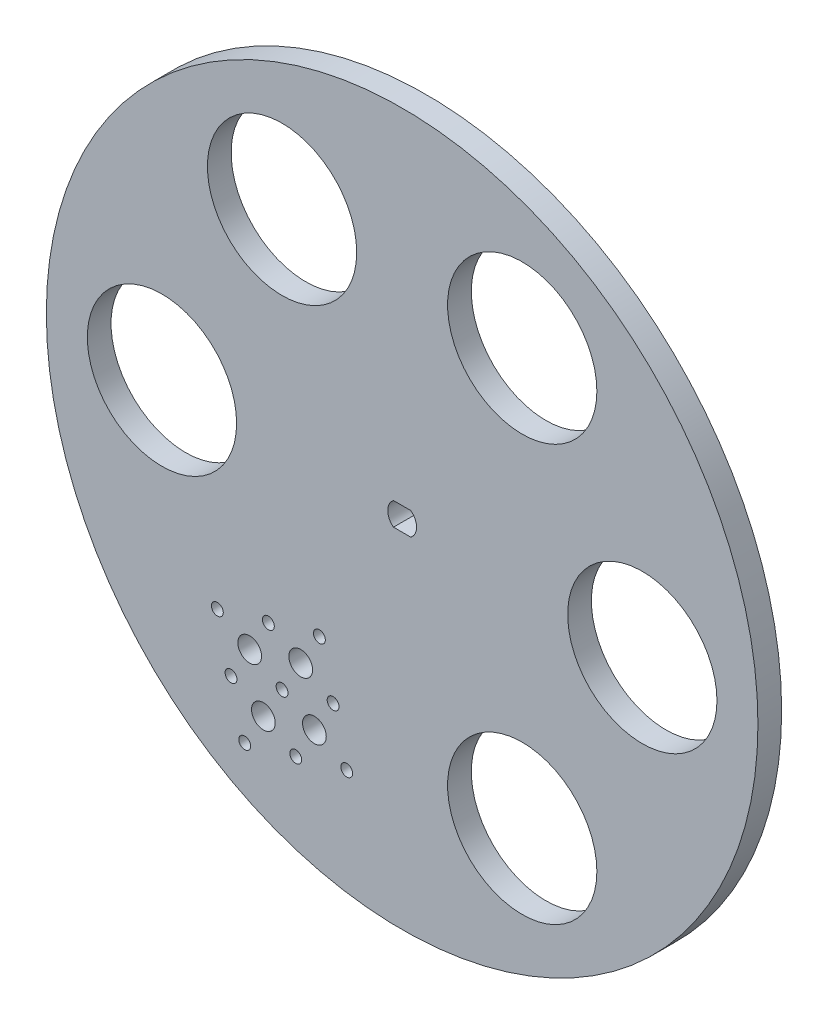
ISO-10303-21;
HEADER;
FILE_DESCRIPTION(('STEP AP214'),'2;1');
FILE_NAME('part.step','',(''),(''),'','','');
FILE_SCHEMA(('AUTOMOTIVE_DESIGN { 1 0 10303 214 1 1 1 1 }'));
ENDSEC;
DATA;
#1=APPLICATION_CONTEXT('core data for automotive mechanical design processes');
#2=APPLICATION_PROTOCOL_DEFINITION('international standard','automotive_design',2000,#1);
#3=PRODUCT_CONTEXT('',#1,'mechanical');
#4=PRODUCT('Part','Part','',(#3));
#5=PRODUCT_RELATED_PRODUCT_CATEGORY('part','',(#4));
#6=PRODUCT_DEFINITION_FORMATION('','',#4);
#7=PRODUCT_DEFINITION_CONTEXT('part definition',#1,'design');
#8=PRODUCT_DEFINITION('design','',#6,#7);
#9=PRODUCT_DEFINITION_SHAPE('','',#8);
#10=(LENGTH_UNIT() NAMED_UNIT(*) SI_UNIT(.MILLI.,.METRE.));
#11=(NAMED_UNIT(*) PLANE_ANGLE_UNIT() SI_UNIT($,.RADIAN.));
#12=(NAMED_UNIT(*) SI_UNIT($,.STERADIAN.) SOLID_ANGLE_UNIT());
#13=UNCERTAINTY_MEASURE_WITH_UNIT(LENGTH_MEASURE(1.E-05),#10,'distance_accuracy_value','');
#14=(GEOMETRIC_REPRESENTATION_CONTEXT(3) GLOBAL_UNCERTAINTY_ASSIGNED_CONTEXT((#13)) GLOBAL_UNIT_ASSIGNED_CONTEXT((#10,
#11,#12)) REPRESENTATION_CONTEXT('',''));
#15=CARTESIAN_POINT('',(0.,0.,0.));
#16=DIRECTION('',(0.,0.,1.));
#17=DIRECTION('',(1.,0.,0.));
#18=AXIS2_PLACEMENT_3D('',#15,#16,#17);
#19=CARTESIAN_POINT('',(0.,0.,4.));
#20=DIRECTION('',(0.,0.,-1.));
#21=DIRECTION('',(-1.,0.,0.));
#22=AXIS2_PLACEMENT_3D('',#19,#20,#21);
#23=CYLINDRICAL_SURFACE('',#22,60.);
#24=CARTESIAN_POINT('',(0.,0.,4.));
#25=DIRECTION('',(0.,0.,1.));
#26=DIRECTION('',(1.,0.,0.));
#27=AXIS2_PLACEMENT_3D('',#24,#25,#26);
#28=CIRCLE('',#27,60.);
#29=CARTESIAN_POINT('',(60.,0.,4.));
#30=VERTEX_POINT('',#29);
#31=EDGE_CURVE('E11',#30,#30,#28,.T.);
#32=ORIENTED_EDGE('',*,*,#31,.F.);
#33=EDGE_LOOP('',(#32));
#34=FACE_BOUND('',#33,.T.);
#35=CARTESIAN_POINT('',(0.,0.,0.));
#36=DIRECTION('',(0.,0.,1.));
#37=DIRECTION('',(1.,0.,0.));
#38=AXIS2_PLACEMENT_3D('',#35,#36,#37);
#39=CIRCLE('',#38,60.);
#40=CARTESIAN_POINT('',(60.,0.,0.));
#41=VERTEX_POINT('',#40);
#42=EDGE_CURVE('E48',#41,#41,#39,.T.);
#43=ORIENTED_EDGE('',*,*,#42,.T.);
#44=EDGE_LOOP('',(#43));
#45=FACE_BOUND('',#44,.T.);
#46=ADVANCED_FACE('F45',(#34,#45),#23,.T.);
#47=CARTESIAN_POINT('',(0.,0.,4.));
#48=DIRECTION('',(0.,0.,1.));
#49=DIRECTION('',(1.,0.,0.));
#50=AXIS2_PLACEMENT_3D('',#47,#48,#49);
#51=PLANE('',#50);
#52=CARTESIAN_POINT('',(-31.161920087684,-28.77402885327,4.));
#53=DIRECTION('',(0.,0.,1.));
#54=DIRECTION('',(1.,0.,0.));
#55=AXIS2_PLACEMENT_3D('',#52,#53,#54);
#56=CIRCLE('',#55,1.00000000000015);
#57=CARTESIAN_POINT('',(-30.1619200876839,-28.77402885327,4.));
#58=VERTEX_POINT('',#57);
#59=EDGE_CURVE('E188',#58,#58,#56,.T.);
#60=ORIENTED_EDGE('',*,*,#59,.F.);
#61=EDGE_LOOP('',(#60));
#62=FACE_BOUND('',#61,.T.);
#63=CARTESIAN_POINT('',(-23.4,-40.5299888971117,4.));
#64=DIRECTION('',(0.,0.,1.));
#65=DIRECTION('',(1.,0.,0.));
#66=AXIS2_PLACEMENT_3D('',#63,#64,#65);
#67=CIRCLE('',#66,2.);
#68=CARTESIAN_POINT('',(-21.4,-40.5299888971117,4.));
#69=VERTEX_POINT('',#68);
#70=EDGE_CURVE('E196',#69,#69,#67,.T.);
#71=ORIENTED_EDGE('',*,*,#70,.F.);
#72=EDGE_LOOP('',(#71));
#73=FACE_BOUND('',#72,.T.);
#74=CARTESIAN_POINT('',(-20.25,-35.0740288532697,4.));
#75=DIRECTION('',(0.,0.,1.));
#76=DIRECTION('',(1.,0.,0.));
#77=AXIS2_PLACEMENT_3D('',#74,#75,#76);
#78=CIRCLE('',#77,1.00000000000001);
#79=CARTESIAN_POINT('',(-19.25,-35.0740288532697,4.));
#80=VERTEX_POINT('',#79);
#81=EDGE_CURVE('E204',#80,#80,#78,.T.);
#82=ORIENTED_EDGE('',*,*,#81,.F.);
#83=EDGE_LOOP('',(#82));
#84=FACE_BOUND('',#83,.T.);
#85=CARTESIAN_POINT('',(-14.794039956158,-38.2240288532697,4.));
#86=DIRECTION('',(0.,0.,1.));
#87=DIRECTION('',(1.,0.,0.));
#88=AXIS2_PLACEMENT_3D('',#85,#86,#87);
#89=CIRCLE('',#88,2.);
#90=CARTESIAN_POINT('',(-12.794039956158,-38.2240288532697,4.));
#91=VERTEX_POINT('',#90);
#92=EDGE_CURVE('E155',#91,#91,#89,.T.);
#93=ORIENTED_EDGE('',*,*,#92,.F.);
#94=EDGE_LOOP('',(#93));
#95=FACE_BOUND('',#94,.T.);
#96=CARTESIAN_POINT('',(-11.644039956158,-32.7680688094278,4.));
#97=DIRECTION('',(0.,0.,1.));
#98=DIRECTION('',(1.,0.,0.));
#99=AXIS2_PLACEMENT_3D('',#96,#97,#98);
#100=CIRCLE('',#99,1.);
#101=CARTESIAN_POINT('',(-10.644039956158,-32.7680688094278,4.));
#102=VERTEX_POINT('',#101);
#103=EDGE_CURVE('E156',#102,#102,#100,.T.);
#104=ORIENTED_EDGE('',*,*,#103,.F.);
#105=EDGE_LOOP('',(#104));
#106=FACE_BOUND('',#105,.T.);
#107=CARTESIAN_POINT('',(-9.33807991231601,-41.3740288532696,4.));
#108=DIRECTION('',(0.,0.,1.));
#109=DIRECTION('',(1.,0.,0.));
#110=AXIS2_PLACEMENT_3D('',#107,#108,#109);
#111=CIRCLE('',#110,0.999999999999997);
#112=CARTESIAN_POINT('',(-8.33807991231601,-41.3740288532696,4.));
#113=VERTEX_POINT('',#112);
#114=EDGE_CURVE('E164',#113,#113,#111,.T.);
#115=ORIENTED_EDGE('',*,*,#114,.F.);
#116=EDGE_LOOP('',(#115));
#117=FACE_BOUND('',#116,.T.);
#118=CARTESIAN_POINT('',(-17.9440399561581,-43.6799888971117,4.));
#119=DIRECTION('',(0.,0.,1.));
#120=DIRECTION('',(1.,0.,0.));
#121=AXIS2_PLACEMENT_3D('',#118,#119,#120);
#122=CIRCLE('',#121,1.00000000000011);
#123=CARTESIAN_POINT('',(-16.944039956158,-43.6799888971117,4.));
#124=VERTEX_POINT('',#123);
#125=EDGE_CURVE('E172',#124,#124,#122,.T.);
#126=ORIENTED_EDGE('',*,*,#125,.F.);
#127=EDGE_LOOP('',(#126));
#128=FACE_BOUND('',#127,.T.);
#129=CARTESIAN_POINT('',(-26.5499999999997,-45.9859489409545,4.));
#130=DIRECTION('',(0.,0.,1.));
#131=DIRECTION('',(1.,0.,0.));
#132=AXIS2_PLACEMENT_3D('',#129,#130,#131);
#133=CIRCLE('',#132,1.00000000000007);
#134=CARTESIAN_POINT('',(-25.5499999999997,-45.9859489409545,4.));
#135=VERTEX_POINT('',#134);
#136=EDGE_CURVE('E128',#135,#135,#133,.T.);
#137=ORIENTED_EDGE('',*,*,#136,.F.);
#138=EDGE_LOOP('',(#137));
#139=FACE_BOUND('',#138,.T.);
#140=CARTESIAN_POINT('',(20.2499999999999,35.0740288532698,4.));
#141=DIRECTION('',(0.,0.,1.));
#142=DIRECTION('',(1.,0.,0.));
#143=AXIS2_PLACEMENT_3D('',#140,#141,#142);
#144=CIRCLE('',#143,12.5875);
#145=CARTESIAN_POINT('',(32.8374999999999,35.0740288532698,4.));
#146=VERTEX_POINT('',#145);
#147=EDGE_CURVE('E252',#146,#146,#144,.T.);
#148=ORIENTED_EDGE('',*,*,#147,.F.);
#149=EDGE_LOOP('',(#148));
#150=FACE_BOUND('',#149,.T.);
#151=CARTESIAN_POINT('',(-20.25,35.0740288532698,4.));
#152=DIRECTION('',(0.,0.,1.));
#153=DIRECTION('',(1.,0.,0.));
#154=AXIS2_PLACEMENT_3D('',#151,#152,#153);
#155=CIRCLE('',#154,12.5875);
#156=CARTESIAN_POINT('',(-7.6625,35.0740288532698,4.));
#157=VERTEX_POINT('',#156);
#158=EDGE_CURVE('E260',#157,#157,#155,.T.);
#159=ORIENTED_EDGE('',*,*,#158,.F.);
#160=EDGE_LOOP('',(#159));
#161=FACE_BOUND('',#160,.T.);
#162=CARTESIAN_POINT('',(-40.5,0.,4.));
#163=DIRECTION('',(0.,0.,1.));
#164=DIRECTION('',(1.,0.,0.));
#165=AXIS2_PLACEMENT_3D('',#162,#163,#164);
#166=CIRCLE('',#165,12.5875);
#167=CARTESIAN_POINT('',(-27.9125,0.,4.));
#168=VERTEX_POINT('',#167);
#169=EDGE_CURVE('E268',#168,#168,#166,.T.);
#170=ORIENTED_EDGE('',*,*,#169,.F.);
#171=EDGE_LOOP('',(#170));
#172=FACE_BOUND('',#171,.T.);
#173=CARTESIAN_POINT('',(20.25,-35.0740288532697,4.));
#174=DIRECTION('',(0.,0.,1.));
#175=DIRECTION('',(1.,0.,0.));
#176=AXIS2_PLACEMENT_3D('',#173,#174,#175);
#177=CIRCLE('',#176,12.5875);
#178=CARTESIAN_POINT('',(32.8375,-35.0740288532697,4.));
#179=VERTEX_POINT('',#178);
#180=EDGE_CURVE('E219',#179,#179,#177,.T.);
#181=ORIENTED_EDGE('',*,*,#180,.F.);
#182=EDGE_LOOP('',(#181));
#183=FACE_BOUND('',#182,.T.);
#184=CARTESIAN_POINT('',(-13.9500000000001,-24.1621087655858,4.));
#185=DIRECTION('',(0.,0.,1.));
#186=DIRECTION('',(1.,0.,0.));
#187=AXIS2_PLACEMENT_3D('',#184,#185,#186);
#188=CIRCLE('',#187,1.);
#189=CARTESIAN_POINT('',(-12.9500000000001,-24.1621087655858,4.));
#190=VERTEX_POINT('',#189);
#191=EDGE_CURVE('E220',#190,#190,#188,.T.);
#192=ORIENTED_EDGE('',*,*,#191,.F.);
#193=EDGE_LOOP('',(#192));
#194=FACE_BOUND('',#193,.T.);
#195=CARTESIAN_POINT('',(-17.1,-29.6180688094278,4.));
#196=DIRECTION('',(0.,0.,1.));
#197=DIRECTION('',(1.,0.,0.));
#198=AXIS2_PLACEMENT_3D('',#195,#196,#197);
#199=CIRCLE('',#198,2.00000000000004);
#200=CARTESIAN_POINT('',(-15.1,-29.6180688094278,4.));
#201=VERTEX_POINT('',#200);
#202=EDGE_CURVE('E228',#201,#201,#199,.T.);
#203=ORIENTED_EDGE('',*,*,#202,.F.);
#204=EDGE_LOOP('',(#203));
#205=FACE_BOUND('',#204,.T.);
#206=CARTESIAN_POINT('',(-22.555960043842,-26.4680688094279,4.));
#207=DIRECTION('',(0.,0.,1.));
#208=DIRECTION('',(1.,0.,0.));
#209=AXIS2_PLACEMENT_3D('',#206,#207,#208);
#210=CIRCLE('',#209,0.99999999999999);
#211=CARTESIAN_POINT('',(-21.555960043842,-26.4680688094279,4.));
#212=VERTEX_POINT('',#211);
#213=EDGE_CURVE('E236',#212,#212,#210,.T.);
#214=ORIENTED_EDGE('',*,*,#213,.F.);
#215=EDGE_LOOP('',(#214));
#216=FACE_BOUND('',#215,.T.);
#217=CARTESIAN_POINT('',(-25.705960043842,-31.9240288532699,4.));
#218=DIRECTION('',(0.,0.,1.));
#219=DIRECTION('',(1.,0.,0.));
#220=AXIS2_PLACEMENT_3D('',#217,#218,#219);
#221=CIRCLE('',#220,2.00000000000006);
#222=CARTESIAN_POINT('',(-23.7059600438419,-31.9240288532699,4.));
#223=VERTEX_POINT('',#222);
#224=EDGE_CURVE('E187',#223,#223,#221,.T.);
#225=ORIENTED_EDGE('',*,*,#224,.F.);
#226=EDGE_LOOP('',(#225));
#227=FACE_BOUND('',#226,.T.);
#228=CARTESIAN_POINT('',(-28.8559600438419,-37.3799888971118,4.));
#229=DIRECTION('',(0.,0.,1.));
#230=DIRECTION('',(1.,0.,0.));
#231=AXIS2_PLACEMENT_3D('',#228,#229,#230);
#232=CIRCLE('',#231,0.999999999999998);
#233=CARTESIAN_POINT('',(-27.8559600438419,-37.3799888971118,4.));
#234=VERTEX_POINT('',#233);
#235=EDGE_CURVE('E129',#234,#234,#232,.T.);
#236=ORIENTED_EDGE('',*,*,#235,.F.);
#237=EDGE_LOOP('',(#236));
#238=FACE_BOUND('',#237,.T.);
#239=CARTESIAN_POINT('',(0.,0.,4.));
#240=DIRECTION('',(0.,0.,1.));
#241=DIRECTION('',(1.,0.,0.));
#242=AXIS2_PLACEMENT_3D('',#239,#240,#241);
#243=CIRCLE('',#242,2.43);
#244=CARTESIAN_POINT('',(1.46,-1.94249839124772,4.));
#245=VERTEX_POINT('',#244);
#246=CARTESIAN_POINT('',(1.46,1.94249839124772,4.));
#247=VERTEX_POINT('',#246);
#248=EDGE_CURVE('E146',#245,#247,#243,.T.);
#249=ORIENTED_EDGE('',*,*,#248,.F.);
#250=DIRECTION('',(1.,0.,0.));
#251=VECTOR('',#250,1.);
#252=CARTESIAN_POINT('',(0.,-1.94249839124772,4.));
#253=LINE('',#252,#251);
#254=CARTESIAN_POINT('',(-1.46,-1.94249839124772,4.));
#255=VERTEX_POINT('',#254);
#256=EDGE_CURVE('E68',#255,#245,#253,.T.);
#257=ORIENTED_EDGE('',*,*,#256,.F.);
#258=CARTESIAN_POINT('',(0.,0.,4.));
#259=DIRECTION('',(0.,0.,1.));
#260=DIRECTION('',(1.,0.,0.));
#261=AXIS2_PLACEMENT_3D('',#258,#259,#260);
#262=CIRCLE('',#261,2.43);
#263=CARTESIAN_POINT('',(-1.45999999999999,1.94249839124771,4.));
#264=VERTEX_POINT('',#263);
#265=EDGE_CURVE('E140',#264,#255,#262,.T.);
#266=ORIENTED_EDGE('',*,*,#265,.F.);
#267=DIRECTION('',(-1.,0.,0.));
#268=VECTOR('',#267,1.);
#269=CARTESIAN_POINT('',(0.,1.94249839124772,4.));
#270=LINE('',#269,#268);
#271=EDGE_CURVE('E143',#247,#264,#270,.T.);
#272=ORIENTED_EDGE('',*,*,#271,.F.);
#273=EDGE_LOOP('',(#249,#257,#266,#272));
#274=FACE_BOUND('',#273,.T.);
#275=CARTESIAN_POINT('',(40.5,0.,4.));
#276=DIRECTION('',(0.,0.,1.));
#277=DIRECTION('',(1.,0.,0.));
#278=AXIS2_PLACEMENT_3D('',#275,#276,#277);
#279=CIRCLE('',#278,12.5875);
#280=CARTESIAN_POINT('',(53.0875,0.,4.));
#281=VERTEX_POINT('',#280);
#282=EDGE_CURVE('E279',#281,#281,#279,.T.);
#283=ORIENTED_EDGE('',*,*,#282,.F.);
#284=EDGE_LOOP('',(#283));
#285=FACE_BOUND('',#284,.T.);
#286=ORIENTED_EDGE('',*,*,#31,.T.);
#287=EDGE_LOOP('',(#286));
#288=FACE_BOUND('',#287,.T.);
#289=ADVANCED_FACE('F299',(#62,#73,#84,#95,#106,#117,#128,#139,#150,#161,#172,#183,#194,#205,
#216,#227,#238,#274,#285,#288),#51,.T.);
#290=CARTESIAN_POINT('',(0.,0.,0.));
#291=DIRECTION('',(0.,0.,1.));
#292=DIRECTION('',(1.,0.,0.));
#293=AXIS2_PLACEMENT_3D('',#290,#291,#292);
#294=PLANE('',#293);
#295=CARTESIAN_POINT('',(0.,0.,0.));
#296=DIRECTION('',(0.,0.,1.));
#297=DIRECTION('',(1.,0.,0.));
#298=AXIS2_PLACEMENT_3D('',#295,#296,#297);
#299=CIRCLE('',#298,4.5);
#300=CARTESIAN_POINT('',(4.5,0.,0.));
#301=VERTEX_POINT('',#300);
#302=EDGE_CURVE('E110',#301,#301,#299,.T.);
#303=ORIENTED_EDGE('',*,*,#302,.T.);
#304=EDGE_LOOP('',(#303));
#305=FACE_BOUND('',#304,.T.);
#306=CARTESIAN_POINT('',(-31.161920087684,-28.77402885327,0.));
#307=DIRECTION('',(0.,0.,1.));
#308=DIRECTION('',(1.,0.,0.));
#309=AXIS2_PLACEMENT_3D('',#306,#307,#308);
#310=CIRCLE('',#309,1.00000000000015);
#311=CARTESIAN_POINT('',(-30.1619200876839,-28.77402885327,0.));
#312=VERTEX_POINT('',#311);
#313=EDGE_CURVE('E183',#312,#312,#310,.T.);
#314=ORIENTED_EDGE('',*,*,#313,.T.);
#315=EDGE_LOOP('',(#314));
#316=FACE_BOUND('',#315,.T.);
#317=CARTESIAN_POINT('',(-23.4,-40.5299888971117,0.));
#318=DIRECTION('',(0.,0.,1.));
#319=DIRECTION('',(1.,0.,0.));
#320=AXIS2_PLACEMENT_3D('',#317,#318,#319);
#321=CIRCLE('',#320,2.);
#322=CARTESIAN_POINT('',(-21.4,-40.5299888971117,0.));
#323=VERTEX_POINT('',#322);
#324=EDGE_CURVE('E192',#323,#323,#321,.T.);
#325=ORIENTED_EDGE('',*,*,#324,.T.);
#326=EDGE_LOOP('',(#325));
#327=FACE_BOUND('',#326,.T.);
#328=CARTESIAN_POINT('',(-20.25,-35.0740288532697,0.));
#329=DIRECTION('',(0.,0.,1.));
#330=DIRECTION('',(1.,0.,0.));
#331=AXIS2_PLACEMENT_3D('',#328,#329,#330);
#332=CIRCLE('',#331,1.00000000000001);
#333=CARTESIAN_POINT('',(-19.25,-35.0740288532697,0.));
#334=VERTEX_POINT('',#333);
#335=EDGE_CURVE('E200',#334,#334,#332,.T.);
#336=ORIENTED_EDGE('',*,*,#335,.T.);
#337=EDGE_LOOP('',(#336));
#338=FACE_BOUND('',#337,.T.);
#339=CARTESIAN_POINT('',(-14.794039956158,-38.2240288532697,0.));
#340=DIRECTION('',(0.,0.,1.));
#341=DIRECTION('',(1.,0.,0.));
#342=AXIS2_PLACEMENT_3D('',#339,#340,#341);
#343=CIRCLE('',#342,2.);
#344=CARTESIAN_POINT('',(-12.794039956158,-38.2240288532697,0.));
#345=VERTEX_POINT('',#344);
#346=EDGE_CURVE('E208',#345,#345,#343,.T.);
#347=ORIENTED_EDGE('',*,*,#346,.T.);
#348=EDGE_LOOP('',(#347));
#349=FACE_BOUND('',#348,.T.);
#350=CARTESIAN_POINT('',(-11.644039956158,-32.7680688094278,0.));
#351=DIRECTION('',(0.,0.,1.));
#352=DIRECTION('',(1.,0.,0.));
#353=AXIS2_PLACEMENT_3D('',#350,#351,#352);
#354=CIRCLE('',#353,1.);
#355=CARTESIAN_POINT('',(-10.644039956158,-32.7680688094278,0.));
#356=VERTEX_POINT('',#355);
#357=EDGE_CURVE('E151',#356,#356,#354,.T.);
#358=ORIENTED_EDGE('',*,*,#357,.T.);
#359=EDGE_LOOP('',(#358));
#360=FACE_BOUND('',#359,.T.);
#361=CARTESIAN_POINT('',(-9.33807991231601,-41.3740288532696,0.));
#362=DIRECTION('',(0.,0.,1.));
#363=DIRECTION('',(1.,0.,0.));
#364=AXIS2_PLACEMENT_3D('',#361,#362,#363);
#365=CIRCLE('',#364,0.999999999999997);
#366=CARTESIAN_POINT('',(-8.33807991231601,-41.3740288532696,0.));
#367=VERTEX_POINT('',#366);
#368=EDGE_CURVE('E160',#367,#367,#365,.T.);
#369=ORIENTED_EDGE('',*,*,#368,.T.);
#370=EDGE_LOOP('',(#369));
#371=FACE_BOUND('',#370,.T.);
#372=CARTESIAN_POINT('',(-17.9440399561581,-43.6799888971117,0.));
#373=DIRECTION('',(0.,0.,1.));
#374=DIRECTION('',(1.,0.,0.));
#375=AXIS2_PLACEMENT_3D('',#372,#373,#374);
#376=CIRCLE('',#375,1.00000000000011);
#377=CARTESIAN_POINT('',(-16.944039956158,-43.6799888971117,0.));
#378=VERTEX_POINT('',#377);
#379=EDGE_CURVE('E168',#378,#378,#376,.T.);
#380=ORIENTED_EDGE('',*,*,#379,.T.);
#381=EDGE_LOOP('',(#380));
#382=FACE_BOUND('',#381,.T.);
#383=CARTESIAN_POINT('',(-26.5499999999997,-45.9859489409545,0.));
#384=DIRECTION('',(0.,0.,1.));
#385=DIRECTION('',(1.,0.,0.));
#386=AXIS2_PLACEMENT_3D('',#383,#384,#385);
#387=CIRCLE('',#386,1.00000000000007);
#388=CARTESIAN_POINT('',(-25.5499999999997,-45.9859489409545,0.));
#389=VERTEX_POINT('',#388);
#390=EDGE_CURVE('E176',#389,#389,#387,.T.);
#391=ORIENTED_EDGE('',*,*,#390,.T.);
#392=EDGE_LOOP('',(#391));
#393=FACE_BOUND('',#392,.T.);
#394=CARTESIAN_POINT('',(20.2499999999999,35.0740288532698,0.));
#395=DIRECTION('',(0.,0.,1.));
#396=DIRECTION('',(1.,0.,0.));
#397=AXIS2_PLACEMENT_3D('',#394,#395,#396);
#398=CIRCLE('',#397,12.5875);
#399=CARTESIAN_POINT('',(32.8374999999999,35.0740288532698,0.));
#400=VERTEX_POINT('',#399);
#401=EDGE_CURVE('E247',#400,#400,#398,.T.);
#402=ORIENTED_EDGE('',*,*,#401,.T.);
#403=EDGE_LOOP('',(#402));
#404=FACE_BOUND('',#403,.T.);
#405=CARTESIAN_POINT('',(-20.25,35.0740288532698,0.));
#406=DIRECTION('',(0.,0.,1.));
#407=DIRECTION('',(1.,0.,0.));
#408=AXIS2_PLACEMENT_3D('',#405,#406,#407);
#409=CIRCLE('',#408,12.5875);
#410=CARTESIAN_POINT('',(-7.6625,35.0740288532698,0.));
#411=VERTEX_POINT('',#410);
#412=EDGE_CURVE('E256',#411,#411,#409,.T.);
#413=ORIENTED_EDGE('',*,*,#412,.T.);
#414=EDGE_LOOP('',(#413));
#415=FACE_BOUND('',#414,.T.);
#416=CARTESIAN_POINT('',(-40.5,0.,0.));
#417=DIRECTION('',(0.,0.,1.));
#418=DIRECTION('',(1.,0.,0.));
#419=AXIS2_PLACEMENT_3D('',#416,#417,#418);
#420=CIRCLE('',#419,12.5875);
#421=CARTESIAN_POINT('',(-27.9125,0.,0.));
#422=VERTEX_POINT('',#421);
#423=EDGE_CURVE('E264',#422,#422,#420,.T.);
#424=ORIENTED_EDGE('',*,*,#423,.T.);
#425=EDGE_LOOP('',(#424));
#426=FACE_BOUND('',#425,.T.);
#427=CARTESIAN_POINT('',(20.25,-35.0740288532697,0.));
#428=DIRECTION('',(0.,0.,1.));
#429=DIRECTION('',(1.,0.,0.));
#430=AXIS2_PLACEMENT_3D('',#427,#428,#429);
#431=CIRCLE('',#430,12.5875);
#432=CARTESIAN_POINT('',(32.8375,-35.0740288532697,0.));
#433=VERTEX_POINT('',#432);
#434=EDGE_CURVE('E272',#433,#433,#431,.T.);
#435=ORIENTED_EDGE('',*,*,#434,.T.);
#436=EDGE_LOOP('',(#435));
#437=FACE_BOUND('',#436,.T.);
#438=CARTESIAN_POINT('',(-13.9500000000001,-24.1621087655858,0.));
#439=DIRECTION('',(0.,0.,1.));
#440=DIRECTION('',(1.,0.,0.));
#441=AXIS2_PLACEMENT_3D('',#438,#439,#440);
#442=CIRCLE('',#441,1.);
#443=CARTESIAN_POINT('',(-12.9500000000001,-24.1621087655858,0.));
#444=VERTEX_POINT('',#443);
#445=EDGE_CURVE('E215',#444,#444,#442,.T.);
#446=ORIENTED_EDGE('',*,*,#445,.T.);
#447=EDGE_LOOP('',(#446));
#448=FACE_BOUND('',#447,.T.);
#449=CARTESIAN_POINT('',(-17.1,-29.6180688094278,0.));
#450=DIRECTION('',(0.,0.,1.));
#451=DIRECTION('',(1.,0.,0.));
#452=AXIS2_PLACEMENT_3D('',#449,#450,#451);
#453=CIRCLE('',#452,2.00000000000004);
#454=CARTESIAN_POINT('',(-15.1,-29.6180688094278,0.));
#455=VERTEX_POINT('',#454);
#456=EDGE_CURVE('E224',#455,#455,#453,.T.);
#457=ORIENTED_EDGE('',*,*,#456,.T.);
#458=EDGE_LOOP('',(#457));
#459=FACE_BOUND('',#458,.T.);
#460=CARTESIAN_POINT('',(-22.555960043842,-26.4680688094279,0.));
#461=DIRECTION('',(0.,0.,1.));
#462=DIRECTION('',(1.,0.,0.));
#463=AXIS2_PLACEMENT_3D('',#460,#461,#462);
#464=CIRCLE('',#463,0.99999999999999);
#465=CARTESIAN_POINT('',(-21.555960043842,-26.4680688094279,0.));
#466=VERTEX_POINT('',#465);
#467=EDGE_CURVE('E232',#466,#466,#464,.T.);
#468=ORIENTED_EDGE('',*,*,#467,.T.);
#469=EDGE_LOOP('',(#468));
#470=FACE_BOUND('',#469,.T.);
#471=CARTESIAN_POINT('',(-25.705960043842,-31.9240288532699,0.));
#472=DIRECTION('',(0.,0.,1.));
#473=DIRECTION('',(1.,0.,0.));
#474=AXIS2_PLACEMENT_3D('',#471,#472,#473);
#475=CIRCLE('',#474,2.00000000000006);
#476=CARTESIAN_POINT('',(-23.7059600438419,-31.9240288532699,0.));
#477=VERTEX_POINT('',#476);
#478=EDGE_CURVE('E240',#477,#477,#475,.T.);
#479=ORIENTED_EDGE('',*,*,#478,.T.);
#480=EDGE_LOOP('',(#479));
#481=FACE_BOUND('',#480,.T.);
#482=CARTESIAN_POINT('',(-28.8559600438419,-37.3799888971118,0.));
#483=DIRECTION('',(0.,0.,1.));
#484=DIRECTION('',(1.,0.,0.));
#485=AXIS2_PLACEMENT_3D('',#482,#483,#484);
#486=CIRCLE('',#485,0.999999999999998);
#487=CARTESIAN_POINT('',(-27.8559600438419,-37.3799888971118,0.));
#488=VERTEX_POINT('',#487);
#489=EDGE_CURVE('E124',#488,#488,#486,.T.);
#490=ORIENTED_EDGE('',*,*,#489,.T.);
#491=EDGE_LOOP('',(#490));
#492=FACE_BOUND('',#491,.T.);
#493=CARTESIAN_POINT('',(40.5,0.,0.));
#494=DIRECTION('',(0.,0.,1.));
#495=DIRECTION('',(1.,0.,0.));
#496=AXIS2_PLACEMENT_3D('',#493,#494,#495);
#497=CIRCLE('',#496,12.5875);
#498=CARTESIAN_POINT('',(53.0875,0.,0.));
#499=VERTEX_POINT('',#498);
#500=EDGE_CURVE('E251',#499,#499,#497,.T.);
#501=ORIENTED_EDGE('',*,*,#500,.T.);
#502=EDGE_LOOP('',(#501));
#503=FACE_BOUND('',#502,.T.);
#504=ORIENTED_EDGE('',*,*,#42,.F.);
#505=EDGE_LOOP('',(#504));
#506=FACE_BOUND('',#505,.T.);
#507=ADVANCED_FACE('F287',(#305,#316,#327,#338,#349,#360,#371,#382,#393,#404,#415,#426,#437,
#448,#459,#470,#481,#492,#503,#506),#294,.F.);
#508=CARTESIAN_POINT('',(40.5,0.,4.));
#509=DIRECTION('',(0.,0.,-1.));
#510=DIRECTION('',(-1.,0.,0.));
#511=AXIS2_PLACEMENT_3D('',#508,#509,#510);
#512=CYLINDRICAL_SURFACE('',#511,12.5875);
#513=ORIENTED_EDGE('',*,*,#282,.T.);
#514=EDGE_LOOP('',(#513));
#515=FACE_BOUND('',#514,.T.);
#516=ORIENTED_EDGE('',*,*,#500,.F.);
#517=EDGE_LOOP('',(#516));
#518=FACE_BOUND('',#517,.T.);
#519=ADVANCED_FACE('F290',(#515,#518),#512,.F.);
#520=CARTESIAN_POINT('',(0.,-1.94249839124772,4.));
#521=DIRECTION('',(0.,1.,0.));
#522=DIRECTION('',(0.,0.,1.));
#523=AXIS2_PLACEMENT_3D('',#520,#521,#522);
#524=PLANE('',#523);
#525=DIRECTION('',(0.,0.,-1.));
#526=VECTOR('',#525,1.);
#527=CARTESIAN_POINT('',(1.46,-1.94249839124772,4.));
#528=LINE('',#527,#526);
#529=CARTESIAN_POINT('',(1.46,-1.94249839124772,-2.85));
#530=VERTEX_POINT('',#529);
#531=EDGE_CURVE('E85',#245,#530,#528,.T.);
#532=ORIENTED_EDGE('',*,*,#531,.T.);
#533=DIRECTION('',(1.,0.,0.));
#534=VECTOR('',#533,1.);
#535=CARTESIAN_POINT('',(0.,-1.94249839124772,-2.85));
#536=LINE('',#535,#534);
#537=CARTESIAN_POINT('',(-1.46,-1.94249839124772,-2.85));
#538=VERTEX_POINT('',#537);
#539=EDGE_CURVE('E88',#538,#530,#536,.T.);
#540=ORIENTED_EDGE('',*,*,#539,.F.);
#541=DIRECTION('',(0.,0.,-1.));
#542=VECTOR('',#541,1.);
#543=CARTESIAN_POINT('',(-1.46,-1.94249839124772,4.));
#544=LINE('',#543,#542);
#545=EDGE_CURVE('E137',#255,#538,#544,.T.);
#546=ORIENTED_EDGE('',*,*,#545,.F.);
#547=ORIENTED_EDGE('',*,*,#256,.T.);
#548=EDGE_LOOP('',(#532,#540,#546,#547));
#549=FACE_BOUND('',#548,.T.);
#550=ADVANCED_FACE('F87',(#549),#524,.T.);
#551=CARTESIAN_POINT('',(0.,0.,4.));
#552=DIRECTION('',(0.,0.,-1.));
#553=DIRECTION('',(-1.,0.,0.));
#554=AXIS2_PLACEMENT_3D('',#551,#552,#553);
#555=CYLINDRICAL_SURFACE('',#554,2.43);
#556=DIRECTION('',(0.,0.,-1.));
#557=VECTOR('',#556,1.);
#558=CARTESIAN_POINT('',(1.46,1.94249839124772,4.));
#559=LINE('',#558,#557);
#560=CARTESIAN_POINT('',(1.46,1.94249839124772,-2.85));
#561=VERTEX_POINT('',#560);
#562=EDGE_CURVE('E93',#247,#561,#559,.T.);
#563=ORIENTED_EDGE('',*,*,#562,.T.);
#564=CARTESIAN_POINT('',(0.,0.,-2.85));
#565=DIRECTION('',(0.,0.,1.));
#566=DIRECTION('',(1.,0.,0.));
#567=AXIS2_PLACEMENT_3D('',#564,#565,#566);
#568=CIRCLE('',#567,2.43);
#569=EDGE_CURVE('E102',#530,#561,#568,.T.);
#570=ORIENTED_EDGE('',*,*,#569,.F.);
#571=ORIENTED_EDGE('',*,*,#531,.F.);
#572=ORIENTED_EDGE('',*,*,#248,.T.);
#573=EDGE_LOOP('',(#563,#570,#571,#572));
#574=FACE_BOUND('',#573,.T.);
#575=ADVANCED_FACE('F106',(#574),#555,.F.);
#576=CARTESIAN_POINT('',(0.,1.94249839124772,4.));
#577=DIRECTION('',(0.,-1.,0.));
#578=DIRECTION('',(0.,0.,-1.));
#579=AXIS2_PLACEMENT_3D('',#576,#577,#578);
#580=PLANE('',#579);
#581=DIRECTION('',(0.,0.,-1.));
#582=VECTOR('',#581,1.);
#583=CARTESIAN_POINT('',(-1.46,1.94249839124772,4.));
#584=LINE('',#583,#582);
#585=CARTESIAN_POINT('',(-1.46,1.94249839124772,-2.85));
#586=VERTEX_POINT('',#585);
#587=EDGE_CURVE('E60',#264,#586,#584,.T.);
#588=ORIENTED_EDGE('',*,*,#587,.T.);
#589=DIRECTION('',(-1.,0.,0.));
#590=VECTOR('',#589,1.);
#591=CARTESIAN_POINT('',(0.,1.94249839124772,-2.85));
#592=LINE('',#591,#590);
#593=EDGE_CURVE('E118',#561,#586,#592,.T.);
#594=ORIENTED_EDGE('',*,*,#593,.F.);
#595=ORIENTED_EDGE('',*,*,#562,.F.);
#596=ORIENTED_EDGE('',*,*,#271,.T.);
#597=EDGE_LOOP('',(#588,#594,#595,#596));
#598=FACE_BOUND('',#597,.T.);
#599=ADVANCED_FACE('F356',(#598),#580,.T.);
#600=CARTESIAN_POINT('',(0.,0.,4.));
#601=DIRECTION('',(0.,0.,-1.));
#602=DIRECTION('',(-1.,0.,0.));
#603=AXIS2_PLACEMENT_3D('',#600,#601,#602);
#604=CYLINDRICAL_SURFACE('',#603,2.43);
#605=ORIENTED_EDGE('',*,*,#545,.T.);
#606=CARTESIAN_POINT('',(0.,0.,-2.85));
#607=DIRECTION('',(0.,0.,1.));
#608=DIRECTION('',(1.,0.,0.));
#609=AXIS2_PLACEMENT_3D('',#606,#607,#608);
#610=CIRCLE('',#609,2.43);
#611=EDGE_CURVE('E103',#586,#538,#610,.T.);
#612=ORIENTED_EDGE('',*,*,#611,.F.);
#613=ORIENTED_EDGE('',*,*,#587,.F.);
#614=ORIENTED_EDGE('',*,*,#265,.T.);
#615=EDGE_LOOP('',(#605,#612,#613,#614));
#616=FACE_BOUND('',#615,.T.);
#617=ADVANCED_FACE('F357',(#616),#604,.F.);
#618=CARTESIAN_POINT('',(-28.8559600438419,-37.3799888971118,4.));
#619=DIRECTION('',(0.,0.,-1.));
#620=DIRECTION('',(-1.,0.,0.));
#621=AXIS2_PLACEMENT_3D('',#618,#619,#620);
#622=CYLINDRICAL_SURFACE('',#621,0.999999999999998);
#623=ORIENTED_EDGE('',*,*,#235,.T.);
#624=EDGE_LOOP('',(#623));
#625=FACE_BOUND('',#624,.T.);
#626=ORIENTED_EDGE('',*,*,#489,.F.);
#627=EDGE_LOOP('',(#626));
#628=FACE_BOUND('',#627,.T.);
#629=ADVANCED_FACE('F359',(#625,#628),#622,.F.);
#630=CARTESIAN_POINT('',(-25.705960043842,-31.9240288532699,4.));
#631=DIRECTION('',(0.,0.,-1.));
#632=DIRECTION('',(-1.,0.,0.));
#633=AXIS2_PLACEMENT_3D('',#630,#631,#632);
#634=CYLINDRICAL_SURFACE('',#633,2.00000000000006);
#635=ORIENTED_EDGE('',*,*,#224,.T.);
#636=EDGE_LOOP('',(#635));
#637=FACE_BOUND('',#636,.T.);
#638=ORIENTED_EDGE('',*,*,#478,.F.);
#639=EDGE_LOOP('',(#638));
#640=FACE_BOUND('',#639,.T.);
#641=ADVANCED_FACE('F365',(#637,#640),#634,.F.);
#642=CARTESIAN_POINT('',(-22.555960043842,-26.4680688094279,4.));
#643=DIRECTION('',(0.,0.,-1.));
#644=DIRECTION('',(-1.,0.,0.));
#645=AXIS2_PLACEMENT_3D('',#642,#643,#644);
#646=CYLINDRICAL_SURFACE('',#645,0.99999999999999);
#647=ORIENTED_EDGE('',*,*,#213,.T.);
#648=EDGE_LOOP('',(#647));
#649=FACE_BOUND('',#648,.T.);
#650=ORIENTED_EDGE('',*,*,#467,.F.);
#651=EDGE_LOOP('',(#650));
#652=FACE_BOUND('',#651,.T.);
#653=ADVANCED_FACE('F413',(#649,#652),#646,.F.);
#654=CARTESIAN_POINT('',(-17.1,-29.6180688094278,4.));
#655=DIRECTION('',(0.,0.,-1.));
#656=DIRECTION('',(-1.,0.,0.));
#657=AXIS2_PLACEMENT_3D('',#654,#655,#656);
#658=CYLINDRICAL_SURFACE('',#657,2.00000000000004);
#659=ORIENTED_EDGE('',*,*,#202,.T.);
#660=EDGE_LOOP('',(#659));
#661=FACE_BOUND('',#660,.T.);
#662=ORIENTED_EDGE('',*,*,#456,.F.);
#663=EDGE_LOOP('',(#662));
#664=FACE_BOUND('',#663,.T.);
#665=ADVANCED_FACE('F409',(#661,#664),#658,.F.);
#666=CARTESIAN_POINT('',(-13.9500000000001,-24.1621087655858,4.));
#667=DIRECTION('',(0.,0.,-1.));
#668=DIRECTION('',(-1.,0.,0.));
#669=AXIS2_PLACEMENT_3D('',#666,#667,#668);
#670=CYLINDRICAL_SURFACE('',#669,1.);
#671=ORIENTED_EDGE('',*,*,#191,.T.);
#672=EDGE_LOOP('',(#671));
#673=FACE_BOUND('',#672,.T.);
#674=ORIENTED_EDGE('',*,*,#445,.F.);
#675=EDGE_LOOP('',(#674));
#676=FACE_BOUND('',#675,.T.);
#677=ADVANCED_FACE('F405',(#673,#676),#670,.F.);
#678=CARTESIAN_POINT('',(20.25,-35.0740288532697,4.));
#679=DIRECTION('',(0.,0.,-1.));
#680=DIRECTION('',(-1.,0.,0.));
#681=AXIS2_PLACEMENT_3D('',#678,#679,#680);
#682=CYLINDRICAL_SURFACE('',#681,12.5875);
#683=ORIENTED_EDGE('',*,*,#180,.T.);
#684=EDGE_LOOP('',(#683));
#685=FACE_BOUND('',#684,.T.);
#686=ORIENTED_EDGE('',*,*,#434,.F.);
#687=EDGE_LOOP('',(#686));
#688=FACE_BOUND('',#687,.T.);
#689=ADVANCED_FACE('F408',(#685,#688),#682,.F.);
#690=CARTESIAN_POINT('',(-40.5,0.,4.));
#691=DIRECTION('',(0.,0.,-1.));
#692=DIRECTION('',(-1.,0.,0.));
#693=AXIS2_PLACEMENT_3D('',#690,#691,#692);
#694=CYLINDRICAL_SURFACE('',#693,12.5875);
#695=ORIENTED_EDGE('',*,*,#169,.T.);
#696=EDGE_LOOP('',(#695));
#697=FACE_BOUND('',#696,.T.);
#698=ORIENTED_EDGE('',*,*,#423,.F.);
#699=EDGE_LOOP('',(#698));
#700=FACE_BOUND('',#699,.T.);
#701=ADVANCED_FACE('F427',(#697,#700),#694,.F.);
#702=CARTESIAN_POINT('',(-20.25,35.0740288532698,4.));
#703=DIRECTION('',(0.,0.,-1.));
#704=DIRECTION('',(-1.,0.,0.));
#705=AXIS2_PLACEMENT_3D('',#702,#703,#704);
#706=CYLINDRICAL_SURFACE('',#705,12.5875);
#707=ORIENTED_EDGE('',*,*,#158,.T.);
#708=EDGE_LOOP('',(#707));
#709=FACE_BOUND('',#708,.T.);
#710=ORIENTED_EDGE('',*,*,#412,.F.);
#711=EDGE_LOOP('',(#710));
#712=FACE_BOUND('',#711,.T.);
#713=ADVANCED_FACE('F423',(#709,#712),#706,.F.);
#714=CARTESIAN_POINT('',(20.2499999999999,35.0740288532698,4.));
#715=DIRECTION('',(0.,0.,-1.));
#716=DIRECTION('',(-1.,0.,0.));
#717=AXIS2_PLACEMENT_3D('',#714,#715,#716);
#718=CYLINDRICAL_SURFACE('',#717,12.5875);
#719=ORIENTED_EDGE('',*,*,#147,.T.);
#720=EDGE_LOOP('',(#719));
#721=FACE_BOUND('',#720,.T.);
#722=ORIENTED_EDGE('',*,*,#401,.F.);
#723=EDGE_LOOP('',(#722));
#724=FACE_BOUND('',#723,.T.);
#725=ADVANCED_FACE('F387',(#721,#724),#718,.F.);
#726=CARTESIAN_POINT('',(-26.5499999999997,-45.9859489409545,4.));
#727=DIRECTION('',(0.,0.,-1.));
#728=DIRECTION('',(-1.,0.,0.));
#729=AXIS2_PLACEMENT_3D('',#726,#727,#728);
#730=CYLINDRICAL_SURFACE('',#729,1.00000000000007);
#731=ORIENTED_EDGE('',*,*,#136,.T.);
#732=EDGE_LOOP('',(#731));
#733=FACE_BOUND('',#732,.T.);
#734=ORIENTED_EDGE('',*,*,#390,.F.);
#735=EDGE_LOOP('',(#734));
#736=FACE_BOUND('',#735,.T.);
#737=ADVANCED_FACE('F383',(#733,#736),#730,.F.);
#738=CARTESIAN_POINT('',(-17.9440399561581,-43.6799888971117,4.));
#739=DIRECTION('',(0.,0.,-1.));
#740=DIRECTION('',(-1.,0.,0.));
#741=AXIS2_PLACEMENT_3D('',#738,#739,#740);
#742=CYLINDRICAL_SURFACE('',#741,1.00000000000011);
#743=ORIENTED_EDGE('',*,*,#125,.T.);
#744=EDGE_LOOP('',(#743));
#745=FACE_BOUND('',#744,.T.);
#746=ORIENTED_EDGE('',*,*,#379,.F.);
#747=EDGE_LOOP('',(#746));
#748=FACE_BOUND('',#747,.T.);
#749=ADVANCED_FACE('F379',(#745,#748),#742,.F.);
#750=CARTESIAN_POINT('',(-9.33807991231601,-41.3740288532696,4.));
#751=DIRECTION('',(0.,0.,-1.));
#752=DIRECTION('',(-1.,0.,0.));
#753=AXIS2_PLACEMENT_3D('',#750,#751,#752);
#754=CYLINDRICAL_SURFACE('',#753,0.999999999999997);
#755=ORIENTED_EDGE('',*,*,#114,.T.);
#756=EDGE_LOOP('',(#755));
#757=FACE_BOUND('',#756,.T.);
#758=ORIENTED_EDGE('',*,*,#368,.F.);
#759=EDGE_LOOP('',(#758));
#760=FACE_BOUND('',#759,.T.);
#761=ADVANCED_FACE('F375',(#757,#760),#754,.F.);
#762=CARTESIAN_POINT('',(-11.644039956158,-32.7680688094278,4.));
#763=DIRECTION('',(0.,0.,-1.));
#764=DIRECTION('',(-1.,0.,0.));
#765=AXIS2_PLACEMENT_3D('',#762,#763,#764);
#766=CYLINDRICAL_SURFACE('',#765,1.);
#767=ORIENTED_EDGE('',*,*,#103,.T.);
#768=EDGE_LOOP('',(#767));
#769=FACE_BOUND('',#768,.T.);
#770=ORIENTED_EDGE('',*,*,#357,.F.);
#771=EDGE_LOOP('',(#770));
#772=FACE_BOUND('',#771,.T.);
#773=ADVANCED_FACE('F371',(#769,#772),#766,.F.);
#774=CARTESIAN_POINT('',(-14.794039956158,-38.2240288532697,4.));
#775=DIRECTION('',(0.,0.,-1.));
#776=DIRECTION('',(-1.,0.,0.));
#777=AXIS2_PLACEMENT_3D('',#774,#775,#776);
#778=CYLINDRICAL_SURFACE('',#777,2.);
#779=ORIENTED_EDGE('',*,*,#92,.T.);
#780=EDGE_LOOP('',(#779));
#781=FACE_BOUND('',#780,.T.);
#782=ORIENTED_EDGE('',*,*,#346,.F.);
#783=EDGE_LOOP('',(#782));
#784=FACE_BOUND('',#783,.T.);
#785=ADVANCED_FACE('F374',(#781,#784),#778,.F.);
#786=CARTESIAN_POINT('',(-20.25,-35.0740288532697,4.));
#787=DIRECTION('',(0.,0.,-1.));
#788=DIRECTION('',(-1.,0.,0.));
#789=AXIS2_PLACEMENT_3D('',#786,#787,#788);
#790=CYLINDRICAL_SURFACE('',#789,1.00000000000001);
#791=ORIENTED_EDGE('',*,*,#81,.T.);
#792=EDGE_LOOP('',(#791));
#793=FACE_BOUND('',#792,.T.);
#794=ORIENTED_EDGE('',*,*,#335,.F.);
#795=EDGE_LOOP('',(#794));
#796=FACE_BOUND('',#795,.T.);
#797=ADVANCED_FACE('F397',(#793,#796),#790,.F.);
#798=CARTESIAN_POINT('',(-23.4,-40.5299888971117,4.));
#799=DIRECTION('',(0.,0.,-1.));
#800=DIRECTION('',(-1.,0.,0.));
#801=AXIS2_PLACEMENT_3D('',#798,#799,#800);
#802=CYLINDRICAL_SURFACE('',#801,2.);
#803=ORIENTED_EDGE('',*,*,#70,.T.);
#804=EDGE_LOOP('',(#803));
#805=FACE_BOUND('',#804,.T.);
#806=ORIENTED_EDGE('',*,*,#324,.F.);
#807=EDGE_LOOP('',(#806));
#808=FACE_BOUND('',#807,.T.);
#809=ADVANCED_FACE('F393',(#805,#808),#802,.F.);
#810=CARTESIAN_POINT('',(-31.161920087684,-28.77402885327,4.));
#811=DIRECTION('',(0.,0.,-1.));
#812=DIRECTION('',(-1.,0.,0.));
#813=AXIS2_PLACEMENT_3D('',#810,#811,#812);
#814=CYLINDRICAL_SURFACE('',#813,1.00000000000015);
#815=ORIENTED_EDGE('',*,*,#59,.T.);
#816=EDGE_LOOP('',(#815));
#817=FACE_BOUND('',#816,.T.);
#818=ORIENTED_EDGE('',*,*,#313,.F.);
#819=EDGE_LOOP('',(#818));
#820=FACE_BOUND('',#819,.T.);
#821=ADVANCED_FACE('F389',(#817,#820),#814,.F.);
#822=CARTESIAN_POINT('',(0.,0.,-2.85));
#823=DIRECTION('',(0.,0.,1.));
#824=DIRECTION('',(1.,0.,0.));
#825=AXIS2_PLACEMENT_3D('',#822,#823,#824);
#826=CYLINDRICAL_SURFACE('',#825,4.5);
#827=CARTESIAN_POINT('',(0.,0.,-2.85));
#828=DIRECTION('',(0.,0.,1.));
#829=DIRECTION('',(1.,0.,0.));
#830=AXIS2_PLACEMENT_3D('',#827,#828,#829);
#831=CIRCLE('',#830,4.5);
#832=CARTESIAN_POINT('',(4.5,0.,-2.85));
#833=VERTEX_POINT('',#832);
#834=EDGE_CURVE('E94',#833,#833,#831,.T.);
#835=ORIENTED_EDGE('',*,*,#834,.T.);
#836=EDGE_LOOP('',(#835));
#837=FACE_BOUND('',#836,.T.);
#838=ORIENTED_EDGE('',*,*,#302,.F.);
#839=EDGE_LOOP('',(#838));
#840=FACE_BOUND('',#839,.T.);
#841=ADVANCED_FACE('F392',(#837,#840),#826,.T.);
#842=CARTESIAN_POINT('',(0.,0.,-2.85));
#843=DIRECTION('',(0.,0.,1.));
#844=DIRECTION('',(1.,0.,0.));
#845=AXIS2_PLACEMENT_3D('',#842,#843,#844);
#846=PLANE('',#845);
#847=ORIENTED_EDGE('',*,*,#569,.T.);
#848=ORIENTED_EDGE('',*,*,#593,.T.);
#849=ORIENTED_EDGE('',*,*,#611,.T.);
#850=ORIENTED_EDGE('',*,*,#539,.T.);
#851=EDGE_LOOP('',(#847,#848,#849,#850));
#852=FACE_BOUND('',#851,.T.);
#853=ORIENTED_EDGE('',*,*,#834,.F.);
#854=EDGE_LOOP('',(#853));
#855=FACE_BOUND('',#854,.T.);
#856=ADVANCED_FACE('F99',(#852,#855),#846,.F.);
#857=CLOSED_SHELL('',(#46,#289,#507,#519,#550,#575,#599,#617,#629,#641,#653,#665,#677,#689,#701,
#713,#725,#737,#749,#761,#773,#785,#797,#809,#821,#841,#856));
#858=MANIFOLD_SOLID_BREP('B2',#857);
#859=ADVANCED_BREP_SHAPE_REPRESENTATION('',(#18,#858),#14);
#860=SHAPE_DEFINITION_REPRESENTATION(#9,#859);
ENDSEC;
END-ISO-10303-21;
